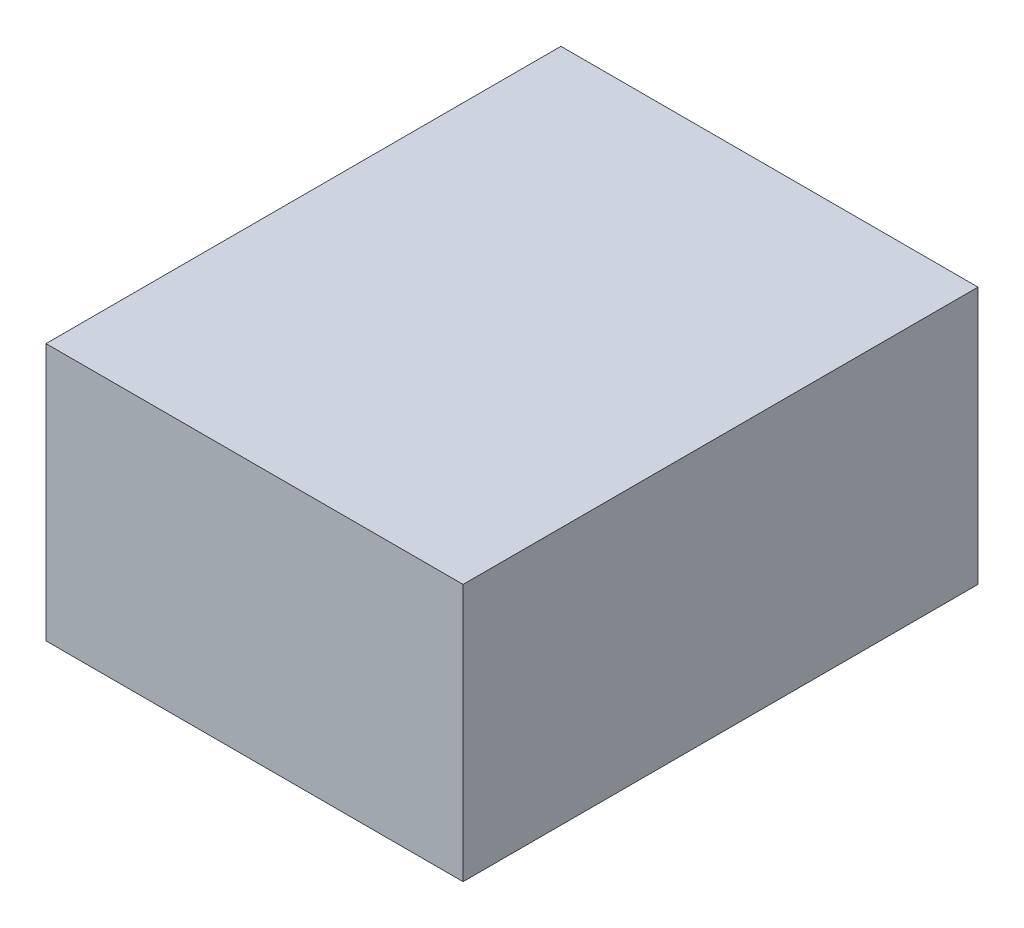
ISO-10303-21;
HEADER;
FILE_DESCRIPTION(('STEP AP214'),'2;1');
FILE_NAME('part.step','',(''),(''),'','','');
FILE_SCHEMA(('AUTOMOTIVE_DESIGN { 1 0 10303 214 1 1 1 1 }'));
ENDSEC;
DATA;
#1=APPLICATION_CONTEXT('core data for automotive mechanical design processes');
#2=APPLICATION_PROTOCOL_DEFINITION('international standard','automotive_design',2000,#1);
#3=PRODUCT_CONTEXT('',#1,'mechanical');
#4=PRODUCT('Part','Part','',(#3));
#5=PRODUCT_RELATED_PRODUCT_CATEGORY('part','',(#4));
#6=PRODUCT_DEFINITION_FORMATION('','',#4);
#7=PRODUCT_DEFINITION_CONTEXT('part definition',#1,'design');
#8=PRODUCT_DEFINITION('design','',#6,#7);
#9=PRODUCT_DEFINITION_SHAPE('','',#8);
#10=(LENGTH_UNIT() NAMED_UNIT(*) SI_UNIT(.MILLI.,.METRE.));
#11=(NAMED_UNIT(*) PLANE_ANGLE_UNIT() SI_UNIT($,.RADIAN.));
#12=(NAMED_UNIT(*) SI_UNIT($,.STERADIAN.) SOLID_ANGLE_UNIT());
#13=UNCERTAINTY_MEASURE_WITH_UNIT(LENGTH_MEASURE(1.E-05),#10,'distance_accuracy_value','');
#14=(GEOMETRIC_REPRESENTATION_CONTEXT(3) GLOBAL_UNCERTAINTY_ASSIGNED_CONTEXT((#13)) GLOBAL_UNIT_ASSIGNED_CONTEXT((#10,
#11,#12)) REPRESENTATION_CONTEXT('',''));
#15=CARTESIAN_POINT('',(0.,0.,0.));
#16=DIRECTION('',(0.,0.,1.));
#17=DIRECTION('',(1.,0.,0.));
#18=AXIS2_PLACEMENT_3D('',#15,#16,#17);
#19=CARTESIAN_POINT('',(0.,-10.,0.));
#20=DIRECTION('',(-1.,0.,0.));
#21=DIRECTION('',(0.,0.,1.));
#22=AXIS2_PLACEMENT_3D('',#19,#20,#21);
#23=PLANE('',#22);
#24=DIRECTION('',(0.,0.,1.));
#25=VECTOR('',#24,1.);
#26=CARTESIAN_POINT('',(0.,0.,0.));
#27=LINE('',#26,#25);
#28=CARTESIAN_POINT('',(0.,0.,-20.));
#29=VERTEX_POINT('',#28);
#30=CARTESIAN_POINT('',(0.,0.,0.));
#31=VERTEX_POINT('',#30);
#32=EDGE_CURVE('E107',#29,#31,#27,.T.);
#33=ORIENTED_EDGE('',*,*,#32,.F.);
#34=DIRECTION('',(0.,1.,0.));
#35=VECTOR('',#34,1.);
#36=CARTESIAN_POINT('',(0.,-10.,-20.));
#37=LINE('',#36,#35);
#38=CARTESIAN_POINT('',(0.,-10.,-20.));
#39=VERTEX_POINT('',#38);
#40=EDGE_CURVE('E11',#39,#29,#37,.T.);
#41=ORIENTED_EDGE('',*,*,#40,.F.);
#42=DIRECTION('',(0.,0.,1.));
#43=VECTOR('',#42,1.);
#44=CARTESIAN_POINT('',(0.,-10.,0.));
#45=LINE('',#44,#43);
#46=CARTESIAN_POINT('',(0.,-10.,0.));
#47=VERTEX_POINT('',#46);
#48=EDGE_CURVE('E102',#39,#47,#45,.T.);
#49=ORIENTED_EDGE('',*,*,#48,.T.);
#50=DIRECTION('',(0.,1.,0.));
#51=VECTOR('',#50,1.);
#52=CARTESIAN_POINT('',(0.,-10.,0.));
#53=LINE('',#52,#51);
#54=EDGE_CURVE('E46',#47,#31,#53,.T.);
#55=ORIENTED_EDGE('',*,*,#54,.T.);
#56=EDGE_LOOP('',(#33,#41,#49,#55));
#57=FACE_BOUND('',#56,.T.);
#58=ADVANCED_FACE('F43',(#57),#23,.T.);
#59=CARTESIAN_POINT('',(0.,-10.,-20.));
#60=DIRECTION('',(0.,0.,-1.));
#61=DIRECTION('',(-1.,0.,0.));
#62=AXIS2_PLACEMENT_3D('',#59,#60,#61);
#63=PLANE('',#62);
#64=DIRECTION('',(-1.,0.,0.));
#65=VECTOR('',#64,1.);
#66=CARTESIAN_POINT('',(0.,0.,-20.));
#67=LINE('',#66,#65);
#68=CARTESIAN_POINT('',(16.2,0.,-20.));
#69=VERTEX_POINT('',#68);
#70=EDGE_CURVE('E104',#69,#29,#67,.T.);
#71=ORIENTED_EDGE('',*,*,#70,.F.);
#72=DIRECTION('',(0.,1.,0.));
#73=VECTOR('',#72,1.);
#74=CARTESIAN_POINT('',(16.2,-10.,-20.));
#75=LINE('',#74,#73);
#76=CARTESIAN_POINT('',(16.2,-10.,-20.));
#77=VERTEX_POINT('',#76);
#78=EDGE_CURVE('E55',#77,#69,#75,.T.);
#79=ORIENTED_EDGE('',*,*,#78,.F.);
#80=DIRECTION('',(-1.,0.,0.));
#81=VECTOR('',#80,1.);
#82=CARTESIAN_POINT('',(0.,-10.,-20.));
#83=LINE('',#82,#81);
#84=EDGE_CURVE('E97',#77,#39,#83,.T.);
#85=ORIENTED_EDGE('',*,*,#84,.T.);
#86=ORIENTED_EDGE('',*,*,#40,.T.);
#87=EDGE_LOOP('',(#71,#79,#85,#86));
#88=FACE_BOUND('',#87,.T.);
#89=ADVANCED_FACE('F117',(#88),#63,.T.);
#90=CARTESIAN_POINT('',(16.2,-10.,0.));
#91=DIRECTION('',(1.,0.,0.));
#92=DIRECTION('',(0.,0.,-1.));
#93=AXIS2_PLACEMENT_3D('',#90,#91,#92);
#94=PLANE('',#93);
#95=DIRECTION('',(0.,0.,-1.));
#96=VECTOR('',#95,1.);
#97=CARTESIAN_POINT('',(16.2,0.,0.));
#98=LINE('',#97,#96);
#99=CARTESIAN_POINT('',(16.2,0.,0.));
#100=VERTEX_POINT('',#99);
#101=EDGE_CURVE('E93',#100,#69,#98,.T.);
#102=ORIENTED_EDGE('',*,*,#101,.F.);
#103=DIRECTION('',(0.,1.,0.));
#104=VECTOR('',#103,1.);
#105=CARTESIAN_POINT('',(16.2,-10.,0.));
#106=LINE('',#105,#104);
#107=CARTESIAN_POINT('',(16.2,-10.,0.));
#108=VERTEX_POINT('',#107);
#109=EDGE_CURVE('E88',#108,#100,#106,.T.);
#110=ORIENTED_EDGE('',*,*,#109,.F.);
#111=DIRECTION('',(0.,0.,-1.));
#112=VECTOR('',#111,1.);
#113=CARTESIAN_POINT('',(16.2,-10.,0.));
#114=LINE('',#113,#112);
#115=EDGE_CURVE('E91',#108,#77,#114,.T.);
#116=ORIENTED_EDGE('',*,*,#115,.T.);
#117=ORIENTED_EDGE('',*,*,#78,.T.);
#118=EDGE_LOOP('',(#102,#110,#116,#117));
#119=FACE_BOUND('',#118,.T.);
#120=ADVANCED_FACE('F89',(#119),#94,.T.);
#121=CARTESIAN_POINT('',(0.,-10.,0.));
#122=DIRECTION('',(0.,0.,1.));
#123=DIRECTION('',(1.,0.,0.));
#124=AXIS2_PLACEMENT_3D('',#121,#122,#123);
#125=PLANE('',#124);
#126=DIRECTION('',(1.,0.,0.));
#127=VECTOR('',#126,1.);
#128=CARTESIAN_POINT('',(0.,0.,0.));
#129=LINE('',#128,#127);
#130=EDGE_CURVE('E110',#31,#100,#129,.T.);
#131=ORIENTED_EDGE('',*,*,#130,.F.);
#132=ORIENTED_EDGE('',*,*,#54,.F.);
#133=DIRECTION('',(1.,0.,0.));
#134=VECTOR('',#133,1.);
#135=CARTESIAN_POINT('',(0.,-10.,0.));
#136=LINE('',#135,#134);
#137=EDGE_CURVE('E100',#47,#108,#136,.T.);
#138=ORIENTED_EDGE('',*,*,#137,.T.);
#139=ORIENTED_EDGE('',*,*,#109,.T.);
#140=EDGE_LOOP('',(#131,#132,#138,#139));
#141=FACE_BOUND('',#140,.T.);
#142=ADVANCED_FACE('F99',(#141),#125,.T.);
#143=CARTESIAN_POINT('',(0.,-10.,0.));
#144=DIRECTION('',(0.,-1.,0.));
#145=DIRECTION('',(0.,0.,-1.));
#146=AXIS2_PLACEMENT_3D('',#143,#144,#145);
#147=PLANE('',#146);
#148=ORIENTED_EDGE('',*,*,#48,.F.);
#149=ORIENTED_EDGE('',*,*,#84,.F.);
#150=ORIENTED_EDGE('',*,*,#115,.F.);
#151=ORIENTED_EDGE('',*,*,#137,.F.);
#152=EDGE_LOOP('',(#148,#149,#150,#151));
#153=FACE_BOUND('',#152,.T.);
#154=ADVANCED_FACE('F96',(#153),#147,.T.);
#155=CARTESIAN_POINT('',(0.,0.,0.));
#156=DIRECTION('',(0.,-1.,0.));
#157=DIRECTION('',(0.,0.,-1.));
#158=AXIS2_PLACEMENT_3D('',#155,#156,#157);
#159=PLANE('',#158);
#160=ORIENTED_EDGE('',*,*,#32,.T.);
#161=ORIENTED_EDGE('',*,*,#130,.T.);
#162=ORIENTED_EDGE('',*,*,#101,.T.);
#163=ORIENTED_EDGE('',*,*,#70,.T.);
#164=EDGE_LOOP('',(#160,#161,#162,#163));
#165=FACE_BOUND('',#164,.T.);
#166=ADVANCED_FACE('F116',(#165),#159,.F.);
#167=CLOSED_SHELL('',(#58,#89,#120,#142,#154,#166));
#168=MANIFOLD_SOLID_BREP('B2',#167);
#169=ADVANCED_BREP_SHAPE_REPRESENTATION('',(#18,#168),#14);
#170=SHAPE_DEFINITION_REPRESENTATION(#9,#169);
ENDSEC;
END-ISO-10303-21;
